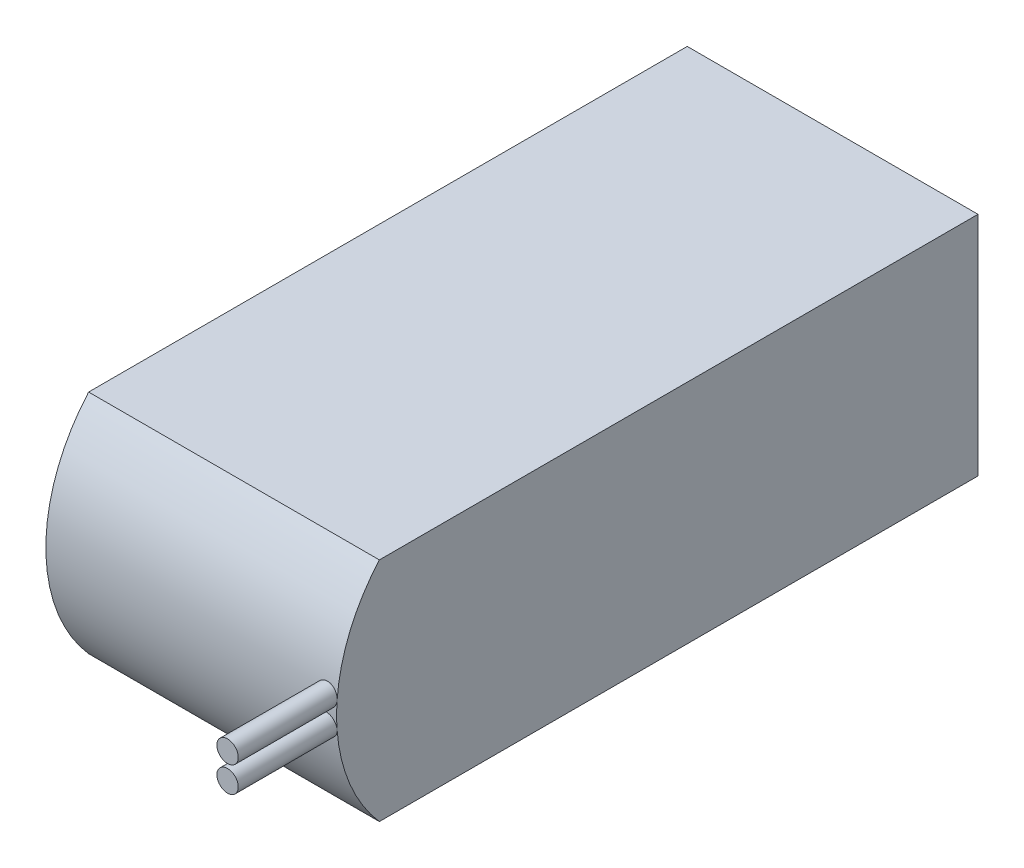
ISO-10303-21;
HEADER;
FILE_DESCRIPTION(('STEP AP214'),'2;1');
FILE_NAME('part.step','',(''),(''),'','','');
FILE_SCHEMA(('AUTOMOTIVE_DESIGN { 1 0 10303 214 1 1 1 1 }'));
ENDSEC;
DATA;
#1=APPLICATION_CONTEXT('core data for automotive mechanical design processes');
#2=APPLICATION_PROTOCOL_DEFINITION('international standard','automotive_design',2000,#1);
#3=PRODUCT_CONTEXT('',#1,'mechanical');
#4=PRODUCT('Part','Part','',(#3));
#5=PRODUCT_RELATED_PRODUCT_CATEGORY('part','',(#4));
#6=PRODUCT_DEFINITION_FORMATION('','',#4);
#7=PRODUCT_DEFINITION_CONTEXT('part definition',#1,'design');
#8=PRODUCT_DEFINITION('design','',#6,#7);
#9=PRODUCT_DEFINITION_SHAPE('','',#8);
#10=(LENGTH_UNIT() NAMED_UNIT(*) SI_UNIT(.MILLI.,.METRE.));
#11=(NAMED_UNIT(*) PLANE_ANGLE_UNIT() SI_UNIT($,.RADIAN.));
#12=(NAMED_UNIT(*) SI_UNIT($,.STERADIAN.) SOLID_ANGLE_UNIT());
#13=UNCERTAINTY_MEASURE_WITH_UNIT(LENGTH_MEASURE(1.E-05),#10,'distance_accuracy_value','');
#14=(GEOMETRIC_REPRESENTATION_CONTEXT(3) GLOBAL_UNCERTAINTY_ASSIGNED_CONTEXT((#13)) GLOBAL_UNIT_ASSIGNED_CONTEXT((#10,
#11,#12)) REPRESENTATION_CONTEXT('',''));
#15=CARTESIAN_POINT('',(0.,0.,0.));
#16=DIRECTION('',(0.,0.,1.));
#17=DIRECTION('',(1.,0.,0.));
#18=AXIS2_PLACEMENT_3D('',#15,#16,#17);
#19=CARTESIAN_POINT('',(0.,0.,140.));
#20=DIRECTION('',(1.,0.,0.));
#21=DIRECTION('',(0.,0.,-1.));
#22=AXIS2_PLACEMENT_3D('',#19,#20,#21);
#23=PLANE('',#22);
#24=DIRECTION('',(0.,-1.,0.));
#25=VECTOR('',#24,1.);
#26=CARTESIAN_POINT('',(0.,0.,0.));
#27=LINE('',#26,#25);
#28=CARTESIAN_POINT('',(0.,53.,0.));
#29=VERTEX_POINT('',#28);
#30=CARTESIAN_POINT('',(0.,0.,0.));
#31=VERTEX_POINT('',#30);
#32=EDGE_CURVE('E112',#29,#31,#27,.T.);
#33=ORIENTED_EDGE('',*,*,#32,.T.);
#34=DIRECTION('',(0.,0.,-1.));
#35=VECTOR('',#34,1.);
#36=CARTESIAN_POINT('',(0.,0.,140.));
#37=LINE('',#36,#35);
#38=CARTESIAN_POINT('',(0.,0.,140.));
#39=VERTEX_POINT('',#38);
#40=EDGE_CURVE('E138',#39,#31,#37,.T.);
#41=ORIENTED_EDGE('',*,*,#40,.F.);
#42=CARTESIAN_POINT('',(0.,26.5,109.8875));
#43=DIRECTION('',(1.,0.,0.));
#44=DIRECTION('',(0.,0.,-1.));
#45=AXIS2_PLACEMENT_3D('',#42,#43,#44);
#46=CIRCLE('',#45,40.1125);
#47=CARTESIAN_POINT('',(0.,53.,140.));
#48=VERTEX_POINT('',#47);
#49=EDGE_CURVE('E111',#48,#39,#46,.T.);
#50=ORIENTED_EDGE('',*,*,#49,.F.);
#51=DIRECTION('',(0.,0.,-1.));
#52=VECTOR('',#51,1.);
#53=CARTESIAN_POINT('',(0.,53.,140.));
#54=LINE('',#53,#52);
#55=EDGE_CURVE('E55',#48,#29,#54,.T.);
#56=ORIENTED_EDGE('',*,*,#55,.T.);
#57=EDGE_LOOP('',(#33,#41,#50,#56));
#58=FACE_BOUND('',#57,.T.);
#59=ADVANCED_FACE('F34',(#58),#23,.F.);
#60=CARTESIAN_POINT('',(0.,0.,140.));
#61=DIRECTION('',(0.,1.,0.));
#62=DIRECTION('',(0.,0.,1.));
#63=AXIS2_PLACEMENT_3D('',#60,#61,#62);
#64=PLANE('',#63);
#65=DIRECTION('',(1.,0.,0.));
#66=VECTOR('',#65,1.);
#67=CARTESIAN_POINT('',(0.,0.,0.));
#68=LINE('',#67,#66);
#69=CARTESIAN_POINT('',(68.,0.,0.));
#70=VERTEX_POINT('',#69);
#71=EDGE_CURVE('E115',#31,#70,#68,.T.);
#72=ORIENTED_EDGE('',*,*,#71,.T.);
#73=DIRECTION('',(0.,0.,-1.));
#74=VECTOR('',#73,1.);
#75=CARTESIAN_POINT('',(68.,0.,140.));
#76=LINE('',#75,#74);
#77=CARTESIAN_POINT('',(68.,0.,140.));
#78=VERTEX_POINT('',#77);
#79=EDGE_CURVE('E142',#78,#70,#76,.T.);
#80=ORIENTED_EDGE('',*,*,#79,.F.);
#81=DIRECTION('',(1.,0.,0.));
#82=VECTOR('',#81,1.);
#83=CARTESIAN_POINT('',(0.,0.,140.));
#84=LINE('',#83,#82);
#85=EDGE_CURVE('E83',#39,#78,#84,.T.);
#86=ORIENTED_EDGE('',*,*,#85,.F.);
#87=ORIENTED_EDGE('',*,*,#40,.T.);
#88=EDGE_LOOP('',(#72,#80,#86,#87));
#89=FACE_BOUND('',#88,.T.);
#90=ADVANCED_FACE('F132',(#89),#64,.F.);
#91=CARTESIAN_POINT('',(68.,0.,140.));
#92=DIRECTION('',(-1.,0.,0.));
#93=DIRECTION('',(0.,0.,1.));
#94=AXIS2_PLACEMENT_3D('',#91,#92,#93);
#95=PLANE('',#94);
#96=CARTESIAN_POINT('',(68.,26.5,109.8875));
#97=DIRECTION('',(1.,0.,0.));
#98=DIRECTION('',(0.,0.,-1.));
#99=AXIS2_PLACEMENT_3D('',#96,#97,#98);
#100=CIRCLE('',#99,40.1125);
#101=CARTESIAN_POINT('',(68.,29.5,149.887658202812));
#102=VERTEX_POINT('',#101);
#103=CARTESIAN_POINT('',(68.,23.5,149.887658202812));
#104=VERTEX_POINT('',#103);
#105=EDGE_CURVE('E93',#102,#104,#100,.T.);
#106=ORIENTED_EDGE('',*,*,#105,.T.);
#107=EDGE_CURVE('E96',#104,#78,#100,.T.);
#108=ORIENTED_EDGE('',*,*,#107,.T.);
#109=ORIENTED_EDGE('',*,*,#79,.T.);
#110=DIRECTION('',(0.,1.,0.));
#111=VECTOR('',#110,1.);
#112=CARTESIAN_POINT('',(68.,0.,0.));
#113=LINE('',#112,#111);
#114=CARTESIAN_POINT('',(68.,53.,0.));
#115=VERTEX_POINT('',#114);
#116=EDGE_CURVE('E74',#70,#115,#113,.T.);
#117=ORIENTED_EDGE('',*,*,#116,.T.);
#118=DIRECTION('',(0.,0.,-1.));
#119=VECTOR('',#118,1.);
#120=CARTESIAN_POINT('',(68.,53.,140.));
#121=LINE('',#120,#119);
#122=CARTESIAN_POINT('',(68.,53.,140.));
#123=VERTEX_POINT('',#122);
#124=EDGE_CURVE('E145',#123,#115,#121,.T.);
#125=ORIENTED_EDGE('',*,*,#124,.F.);
#126=EDGE_CURVE('E98',#123,#102,#100,.T.);
#127=ORIENTED_EDGE('',*,*,#126,.T.);
#128=EDGE_LOOP('',(#106,#108,#109,#117,#125,#127));
#129=FACE_BOUND('',#128,.T.);
#130=ADVANCED_FACE('F95',(#129),#95,.F.);
#131=CARTESIAN_POINT('',(0.,53.,140.));
#132=DIRECTION('',(0.,-1.,0.));
#133=DIRECTION('',(0.,0.,-1.));
#134=AXIS2_PLACEMENT_3D('',#131,#132,#133);
#135=PLANE('',#134);
#136=DIRECTION('',(-1.,0.,0.));
#137=VECTOR('',#136,1.);
#138=CARTESIAN_POINT('',(0.,53.,0.));
#139=LINE('',#138,#137);
#140=EDGE_CURVE('E77',#115,#29,#139,.T.);
#141=ORIENTED_EDGE('',*,*,#140,.T.);
#142=ORIENTED_EDGE('',*,*,#55,.F.);
#143=DIRECTION('',(-1.,0.,0.));
#144=VECTOR('',#143,1.);
#145=CARTESIAN_POINT('',(0.,53.,140.));
#146=LINE('',#145,#144);
#147=EDGE_CURVE('E248',#123,#48,#146,.T.);
#148=ORIENTED_EDGE('',*,*,#147,.F.);
#149=ORIENTED_EDGE('',*,*,#124,.T.);
#150=EDGE_LOOP('',(#141,#142,#148,#149));
#151=FACE_BOUND('',#150,.T.);
#152=ADVANCED_FACE('F206',(#151),#135,.F.);
#153=CARTESIAN_POINT('',(0.,0.,0.));
#154=DIRECTION('',(0.,0.,-1.));
#155=DIRECTION('',(-1.,0.,0.));
#156=AXIS2_PLACEMENT_3D('',#153,#154,#155);
#157=PLANE('',#156);
#158=ORIENTED_EDGE('',*,*,#140,.F.);
#159=ORIENTED_EDGE('',*,*,#116,.F.);
#160=ORIENTED_EDGE('',*,*,#71,.F.);
#161=ORIENTED_EDGE('',*,*,#32,.F.);
#162=EDGE_LOOP('',(#158,#159,#160,#161));
#163=FACE_BOUND('',#162,.T.);
#164=ADVANCED_FACE('F140',(#163),#157,.T.);
#165=CARTESIAN_POINT('',(0.,26.5,109.8875));
#166=DIRECTION('',(1.,0.,0.));
#167=DIRECTION('',(0.,0.,-1.));
#168=AXIS2_PLACEMENT_3D('',#165,#166,#167);
#169=CYLINDRICAL_SURFACE('',#168,40.1125);
#170=ORIENTED_EDGE('',*,*,#107,.F.);
#171=CARTESIAN_POINT('',(63.,23.5,149.887658202812));
#172=CARTESIAN_POINT('',(63.0000062251369,23.3590160846374,149.877083380765));
#173=CARTESIAN_POINT('',(63.0119657313128,23.2179875037208,149.865749733109));
#174=CARTESIAN_POINT('',(63.0594538956752,22.9399343580414,149.841950658494));
#175=CARTESIAN_POINT('',(63.0950112852451,22.8029148871281,149.829483867877));
#176=CARTESIAN_POINT('',(63.1886439835675,22.5369368080331,149.803970618494));
#177=CARTESIAN_POINT('',(63.2467057736336,22.407973414364,149.790924511888));
#178=CARTESIAN_POINT('',(63.3836902509248,22.1616848201086,149.764900018234));
#179=CARTESIAN_POINT('',(63.4626079685317,22.0443568561417,149.751921615803));
#180=CARTESIAN_POINT('',(63.6392702215313,21.8244059423644,149.726724049149));
#181=CARTESIAN_POINT('',(63.7370479685695,21.7218094984128,149.714506275319));
#182=CARTESIAN_POINT('',(63.9486163429538,21.5345052925898,149.691588301941));
#183=CARTESIAN_POINT('',(64.062407340832,21.4497979447695,149.68088813752));
#184=CARTESIAN_POINT('',(64.3023592725654,21.3010203379496,149.661723986009));
#185=CARTESIAN_POINT('',(64.4284736423816,21.2368760371035,149.653251996135));
#186=CARTESIAN_POINT('',(64.6898382434072,21.1307110019086,149.639056935016));
#187=CARTESIAN_POINT('',(64.8250879793734,21.0886890693545,149.633333714892));
#188=CARTESIAN_POINT('',(65.0996946556097,21.0282884090456,149.62506358104));
#189=CARTESIAN_POINT('',(65.2390087636072,21.009718418488,149.622490977681));
#190=CARTESIAN_POINT('',(65.5187992676072,20.9961507211528,149.620614018385));
#191=CARTESIAN_POINT('',(65.6592756163372,21.0011520603088,149.621309530168));
#192=CARTESIAN_POINT('',(65.9366006040314,21.0344817071428,149.625907616517));
#193=CARTESIAN_POINT('',(66.0734647888306,21.0626833208659,149.629792772579));
#194=CARTESIAN_POINT('',(66.3404921154475,21.1414094789408,149.640483896887));
#195=CARTESIAN_POINT('',(66.4706551780551,21.1919342870949,149.647289899651));
#196=CARTESIAN_POINT('',(66.7209938927367,21.3139946746523,149.663394531733));
#197=CARTESIAN_POINT('',(66.8411414202133,21.3855870214899,149.672699889686));
#198=CARTESIAN_POINT('',(67.0677451514839,21.5476724024217,149.693200087565));
#199=CARTESIAN_POINT('',(67.1742007387965,21.638166287079,149.704395012515));
#200=CARTESIAN_POINT('',(67.3713192834062,21.8363140300814,149.728091139386));
#201=CARTESIAN_POINT('',(67.4618470906088,21.9441011665883,149.740602203396));
#202=CARTESIAN_POINT('',(67.6235511684802,22.1732748439264,149.766133109889));
#203=CARTESIAN_POINT('',(67.694726719465,22.2946618902827,149.779152971274));
#204=CARTESIAN_POINT('',(67.8161125277773,22.5484120649026,149.805089493705));
#205=CARTESIAN_POINT('',(67.8661956819709,22.680836133455,149.818005081668));
#206=CARTESIAN_POINT('',(67.9433453910227,22.9523007910332,149.843038464303));
#207=CARTESIAN_POINT('',(67.9704119447934,23.0913413803716,149.855156258938));
#208=CARTESIAN_POINT('',(68.0007089553383,23.3720423688582,149.878103308156));
#209=CARTESIAN_POINT('',(68.0039496435683,23.5137016172822,149.888933113871));
#210=CARTESIAN_POINT('',(67.9864713516889,23.7956497851176,149.908983250997));
#211=CARTESIAN_POINT('',(67.9657529349624,23.9359387366724,149.918203620246));
#212=CARTESIAN_POINT('',(67.9010364915985,24.2105171227853,149.934844148895));
#213=CARTESIAN_POINT('',(67.8571381074244,24.3448295889022,149.942271816859));
#214=CARTESIAN_POINT('',(67.7473355462116,24.6042272017047,149.955387176205));
#215=CARTESIAN_POINT('',(67.6814317727475,24.7293125175632,149.961074899495));
#216=CARTESIAN_POINT('',(67.5297299052815,24.96626117465,149.970842405106));
#217=CARTESIAN_POINT('',(67.4439977341828,25.0781665141451,149.974927397233));
#218=CARTESIAN_POINT('',(67.2549481905257,25.2860271553818,149.981760973631));
#219=CARTESIAN_POINT('',(67.1516308784441,25.3819825119747,149.984509562498));
#220=CARTESIAN_POINT('',(66.9304158962345,25.5551468593164,149.98896417449));
#221=CARTESIAN_POINT('',(66.812527570317,25.6323677710461,149.990670861644));
#222=CARTESIAN_POINT('',(66.5654627957647,25.7659457487956,149.993338765967));
#223=CARTESIAN_POINT('',(66.43628633339,25.8223027894192,149.994299982229));
#224=CARTESIAN_POINT('',(66.1702399002796,25.9125756108917,149.995724123942));
#225=CARTESIAN_POINT('',(66.033366012277,25.9464798511748,149.99618679322));
#226=CARTESIAN_POINT('',(65.7558686523979,25.9908381094265,149.996774611401));
#227=CARTESIAN_POINT('',(65.6152451669584,26.0012920425591,149.996899759081));
#228=CARTESIAN_POINT('',(65.3341951212174,25.9984523226403,149.996864340503));
#229=CARTESIAN_POINT('',(65.1937686340614,25.9851514254541,149.996703687089));
#230=CARTESIAN_POINT('',(64.9171414923601,25.9351655558693,149.996030696304));
#231=CARTESIAN_POINT('',(64.7809408503789,25.898480513953,149.995518357889));
#232=CARTESIAN_POINT('',(64.516629936732,25.8027677006292,149.993968293832));
#233=CARTESIAN_POINT('',(64.3885198432822,25.743739437253,149.992930556622));
#234=CARTESIAN_POINT('',(64.1440373882278,25.6050220168044,149.990074257733));
#235=CARTESIAN_POINT('',(64.0276645572122,25.5253336864501,149.988255727296));
#236=CARTESIAN_POINT('',(63.8100022734061,25.3476043363302,149.983541168618));
#237=CARTESIAN_POINT('',(63.7087067185069,25.2495707777459,149.980645577956));
#238=CARTESIAN_POINT('',(63.5239947628429,25.0378996587587,149.973483928149));
#239=CARTESIAN_POINT('',(63.440582539192,24.9242584629363,149.969217549401));
#240=CARTESIAN_POINT('',(63.2940335151667,24.6846684803154,149.959080876335));
#241=CARTESIAN_POINT('',(63.2308954249535,24.5587204771405,149.953210684097));
#242=CARTESIAN_POINT('',(63.1267090634828,24.2982027816678,149.939736994829));
#243=CARTESIAN_POINT('',(63.0856350777872,24.1636433311878,149.93213553028));
#244=CARTESIAN_POINT('',(63.0374668307519,23.9402118251502,149.918334398189));
#245=CARTESIAN_POINT('',(63.0234309089276,23.8527426451284,149.91264776014));
#246=CARTESIAN_POINT('',(63.0046955498164,23.6768548338686,149.900626342057));
#247=CARTESIAN_POINT('',(62.9999960951044,23.5884362044029,149.894291563232));
#248=CARTESIAN_POINT('',(63.,23.5,149.887658202812));
#249=B_SPLINE_CURVE_WITH_KNOTS('',3,(#171,#172,#173,#174,#175,#176,#177,#178,#179,#180,#181,
#182,#183,#184,#185,#186,#187,#188,#189,#190,#191,#192,#193,#194,#195,#196,#197,#198,#199,#200,
#201,#202,#203,#204,#205,#206,#207,#208,#209,#210,#211,#212,#213,#214,#215,#216,#217,#218,#219,
#220,#221,#222,#223,#224,#225,#226,#227,#228,#229,#230,#231,#232,#233,#234,#235,#236,#237,#238,
#239,#240,#241,#242,#243,#244,#245,#246,#247,#248),.UNSPECIFIED.,.T.,.F.,(4,2,2,2,2,2,2,2,2,2,2,
2,2,2,2,2,2,2,2,2,2,2,2,2,2,2,2,2,2,2,2,2,2,2,2,2,2,2,4),(0.,0.423815049520662,0.84814706011062,
1.27222456301298,1.69620110631981,2.1209311837584,2.54567109068578,2.96886398579513,
3.39203395731316,3.81172998835493,4.23140903204423,4.64881135357193,5.06621860784606,
5.48476104759511,5.90332232567883,6.32527980945991,6.7472529831186,7.17173379876135,
7.59621463446046,8.02051317622879,8.44480174109375,8.86728111219375,9.28975273553027,
9.71083947265622,10.1319247616542,10.5527414014575,10.9735585534894,11.3945918347551,
11.8156266391849,12.2367898618613,12.6579543366017,13.0791280853797,13.5002849833789,
13.9212709636223,14.3423551691462,14.7634125800147,15.1839782022743,15.4498288434905,
15.7156789885374),.UNSPECIFIED.);
#250=EDGE_CURVE('E11',#104,#104,#249,.T.);
#251=ORIENTED_EDGE('',*,*,#250,.F.);
#252=ORIENTED_EDGE('',*,*,#105,.F.);
#253=CARTESIAN_POINT('',(68.,29.5,149.887658202812));
#254=CARTESIAN_POINT('',(67.9999937748631,29.6409839153626,149.877083380765));
#255=CARTESIAN_POINT('',(67.9880342686872,29.7820124962792,149.865749733109));
#256=CARTESIAN_POINT('',(67.9405461043248,30.0600656419586,149.841950658494));
#257=CARTESIAN_POINT('',(67.9049887147549,30.1970851128719,149.829483867877));
#258=CARTESIAN_POINT('',(67.8113560164326,30.4630631919669,149.803970618494));
#259=CARTESIAN_POINT('',(67.7532942263664,30.592026585636,149.790924511888));
#260=CARTESIAN_POINT('',(67.6163097490752,30.8383151798914,149.764900018234));
#261=CARTESIAN_POINT('',(67.5373920314683,30.9556431438583,149.751921615803));
#262=CARTESIAN_POINT('',(67.3607297784687,31.1755940576356,149.726724049149));
#263=CARTESIAN_POINT('',(67.2629520314305,31.2781905015872,149.714506275319));
#264=CARTESIAN_POINT('',(67.0513836570463,31.4654947074101,149.691588301941));
#265=CARTESIAN_POINT('',(66.937592659168,31.5502020552305,149.68088813752));
#266=CARTESIAN_POINT('',(66.6976407274347,31.6989796620504,149.661723986009));
#267=CARTESIAN_POINT('',(66.5715263576184,31.7631239628965,149.653251996135));
#268=CARTESIAN_POINT('',(66.3101617565928,31.8692889980914,149.639056935016));
#269=CARTESIAN_POINT('',(66.1749120206266,31.9113109306455,149.633333714892));
#270=CARTESIAN_POINT('',(65.9003053443903,31.9717115909544,149.62506358104));
#271=CARTESIAN_POINT('',(65.7609912363927,31.990281581512,149.622490977681));
#272=CARTESIAN_POINT('',(65.4812007323928,32.0038492788472,149.620614018385));
#273=CARTESIAN_POINT('',(65.3407243836628,31.9988479396912,149.621309530168));
#274=CARTESIAN_POINT('',(65.0633993959686,31.9655182928572,149.625907616517));
#275=CARTESIAN_POINT('',(64.9265352111694,31.9373166791341,149.629792772579));
#276=CARTESIAN_POINT('',(64.6595078845525,31.8585905210592,149.640483896887));
#277=CARTESIAN_POINT('',(64.5293448219449,31.8080657129051,149.647289899651));
#278=CARTESIAN_POINT('',(64.2790061072633,31.6860053253477,149.663394531733));
#279=CARTESIAN_POINT('',(64.1588585797867,31.6144129785101,149.672699889686));
#280=CARTESIAN_POINT('',(63.9322548485161,31.4523275975783,149.693200087565));
#281=CARTESIAN_POINT('',(63.8257992612035,31.361833712921,149.704395012515));
#282=CARTESIAN_POINT('',(63.6286807165938,31.1636859699186,149.728091139386));
#283=CARTESIAN_POINT('',(63.5381529093912,31.0558988334117,149.740602203396));
#284=CARTESIAN_POINT('',(63.3764488315198,30.8267251560736,149.766133109889));
#285=CARTESIAN_POINT('',(63.305273280535,30.7053381097173,149.779152971274));
#286=CARTESIAN_POINT('',(63.1838874722227,30.4515879350974,149.805089493705));
#287=CARTESIAN_POINT('',(63.1338043180291,30.319163866545,149.818005081668));
#288=CARTESIAN_POINT('',(63.0566546089773,30.0476992089668,149.843038464303));
#289=CARTESIAN_POINT('',(63.0295880552066,29.9086586196284,149.855156258938));
#290=CARTESIAN_POINT('',(62.9992910446617,29.6279576311418,149.878103308156));
#291=CARTESIAN_POINT('',(62.9960503564317,29.4862983827178,149.888933113871));
#292=CARTESIAN_POINT('',(63.0135286483111,29.2043502148824,149.908983250997));
#293=CARTESIAN_POINT('',(63.0342470650376,29.0640612633276,149.918203620246));
#294=CARTESIAN_POINT('',(63.0989635084015,28.7894828772147,149.934844148895));
#295=CARTESIAN_POINT('',(63.1428618925756,28.6551704110978,149.942271816859));
#296=CARTESIAN_POINT('',(63.2526644537884,28.3957727982952,149.955387176205));
#297=CARTESIAN_POINT('',(63.3185682272525,28.2706874824368,149.961074899495));
#298=CARTESIAN_POINT('',(63.4702700947186,28.03373882535,149.970842405106));
#299=CARTESIAN_POINT('',(63.5560022658172,27.9218334858549,149.974927397233));
#300=CARTESIAN_POINT('',(63.7450518094743,27.7139728446182,149.981760973631));
#301=CARTESIAN_POINT('',(63.8483691215559,27.6180174880253,149.984509562498));
#302=CARTESIAN_POINT('',(64.0695841037655,27.4448531406836,149.98896417449));
#303=CARTESIAN_POINT('',(64.187472429683,27.3676322289539,149.990670861644));
#304=CARTESIAN_POINT('',(64.4345372042353,27.2340542512044,149.993338765967));
#305=CARTESIAN_POINT('',(64.5637136666101,27.1776972105808,149.994299982229));
#306=CARTESIAN_POINT('',(64.8297600997204,27.0874243891082,149.995724123942));
#307=CARTESIAN_POINT('',(64.966633987723,27.0535201488252,149.99618679322));
#308=CARTESIAN_POINT('',(65.2441313476021,27.0091618905735,149.996774611401));
#309=CARTESIAN_POINT('',(65.3847548330416,26.9987079574409,149.996899759081));
#310=CARTESIAN_POINT('',(65.6658048787826,27.0015476773597,149.996864340503));
#311=CARTESIAN_POINT('',(65.8062313659386,27.0148485745459,149.996703687089));
#312=CARTESIAN_POINT('',(66.0828585076399,27.0648344441307,149.996030696304));
#313=CARTESIAN_POINT('',(66.2190591496211,27.101519486047,149.995518357889));
#314=CARTESIAN_POINT('',(66.483370063268,27.1972322993708,149.993968293832));
#315=CARTESIAN_POINT('',(66.6114801567178,27.256260562747,149.992930556622));
#316=CARTESIAN_POINT('',(66.8559626117722,27.3949779831956,149.990074257733));
#317=CARTESIAN_POINT('',(66.9723354427878,27.4746663135499,149.988255727296));
#318=CARTESIAN_POINT('',(67.189997726594,27.6523956636698,149.983541168618));
#319=CARTESIAN_POINT('',(67.2912932814931,27.7504292222541,149.980645577956));
#320=CARTESIAN_POINT('',(67.4760052371572,27.9621003412413,149.973483928149));
#321=CARTESIAN_POINT('',(67.559417460808,28.0757415370637,149.969217549401));
#322=CARTESIAN_POINT('',(67.7059664848333,28.3153315196846,149.959080876335));
#323=CARTESIAN_POINT('',(67.7691045750465,28.4412795228595,149.953210684097));
#324=CARTESIAN_POINT('',(67.8732909365172,28.7017972183322,149.939736994829));
#325=CARTESIAN_POINT('',(67.9143649222128,28.8363566688122,149.93213553028));
#326=CARTESIAN_POINT('',(67.9625331692481,29.0597881748498,149.918334398189));
#327=CARTESIAN_POINT('',(67.9765690910724,29.1472573548716,149.91264776014));
#328=CARTESIAN_POINT('',(67.9953044501836,29.3231451661314,149.900626342057));
#329=CARTESIAN_POINT('',(68.0000039048956,29.4115637955971,149.894291563232));
#330=CARTESIAN_POINT('',(68.,29.5,149.887658202812));
#331=B_SPLINE_CURVE_WITH_KNOTS('',3,(#253,#254,#255,#256,#257,#258,#259,#260,#261,#262,#263,
#264,#265,#266,#267,#268,#269,#270,#271,#272,#273,#274,#275,#276,#277,#278,#279,#280,#281,#282,
#283,#284,#285,#286,#287,#288,#289,#290,#291,#292,#293,#294,#295,#296,#297,#298,#299,#300,#301,
#302,#303,#304,#305,#306,#307,#308,#309,#310,#311,#312,#313,#314,#315,#316,#317,#318,#319,#320,
#321,#322,#323,#324,#325,#326,#327,#328,#329,#330),.UNSPECIFIED.,.T.,.F.,(4,2,2,2,2,2,2,2,2,2,2,
2,2,2,2,2,2,2,2,2,2,2,2,2,2,2,2,2,2,2,2,2,2,2,2,2,2,2,4),(0.,0.423815049520662,0.84814706011062,
1.27222456301298,1.69620110631981,2.12093118375838,2.54567109068577,2.96886398579515,
3.39203395731318,3.81172998835495,4.23140903204423,4.64881135357195,5.06621860784607,
5.48476104759511,5.90332232567883,6.32527980945991,6.7472529831186,7.17173379876135,
7.59621463446046,8.02051317622879,8.44480174109375,8.86728111219376,9.28975273553027,
9.71083947265622,10.1319247616542,10.5527414014575,10.9735585534894,11.3945918347551,
11.8156266391849,12.2367898618613,12.6579543366017,13.0791280853797,13.5002849833789,
13.9212709636223,14.3423551691462,14.7634125800147,15.1839782022743,15.4498288434905,
15.7156789885374),.UNSPECIFIED.);
#332=EDGE_CURVE('E47',#102,#102,#331,.T.);
#333=ORIENTED_EDGE('',*,*,#332,.F.);
#334=ORIENTED_EDGE('',*,*,#126,.F.);
#335=ORIENTED_EDGE('',*,*,#147,.T.);
#336=ORIENTED_EDGE('',*,*,#49,.T.);
#337=ORIENTED_EDGE('',*,*,#85,.T.);
#338=EDGE_LOOP('',(#170,#251,#252,#333,#334,#335,#336,#337));
#339=FACE_BOUND('',#338,.T.);
#340=ADVANCED_FACE('F103',(#339),#169,.T.);
#341=CARTESIAN_POINT('',(65.5,29.5,173.));
#342=DIRECTION('',(0.,0.,-1.));
#343=DIRECTION('',(-1.,0.,0.));
#344=AXIS2_PLACEMENT_3D('',#341,#342,#343);
#345=CYLINDRICAL_SURFACE('',#344,2.5);
#346=ORIENTED_EDGE('',*,*,#332,.T.);
#347=EDGE_LOOP('',(#346));
#348=FACE_BOUND('',#347,.T.);
#349=CARTESIAN_POINT('',(65.5,29.5,173.));
#350=DIRECTION('',(0.,0.,-1.));
#351=DIRECTION('',(-1.,0.,0.));
#352=AXIS2_PLACEMENT_3D('',#349,#350,#351);
#353=CIRCLE('',#352,2.5);
#354=CARTESIAN_POINT('',(63.,29.5,173.));
#355=VERTEX_POINT('',#354);
#356=EDGE_CURVE('E105',#355,#355,#353,.T.);
#357=ORIENTED_EDGE('',*,*,#356,.T.);
#358=EDGE_LOOP('',(#357));
#359=FACE_BOUND('',#358,.T.);
#360=ADVANCED_FACE('F154',(#348,#359),#345,.T.);
#361=CARTESIAN_POINT('',(65.5,29.5,173.));
#362=DIRECTION('',(0.,0.,-1.));
#363=DIRECTION('',(-1.,0.,0.));
#364=AXIS2_PLACEMENT_3D('',#361,#362,#363);
#365=PLANE('',#364);
#366=ORIENTED_EDGE('',*,*,#356,.F.);
#367=EDGE_LOOP('',(#366));
#368=FACE_BOUND('',#367,.T.);
#369=ADVANCED_FACE('F129',(#368),#365,.F.);
#370=CARTESIAN_POINT('',(65.5,23.5,173.));
#371=DIRECTION('',(0.,0.,-1.));
#372=DIRECTION('',(-1.,0.,0.));
#373=AXIS2_PLACEMENT_3D('',#370,#371,#372);
#374=CYLINDRICAL_SURFACE('',#373,2.5);
#375=ORIENTED_EDGE('',*,*,#250,.T.);
#376=EDGE_LOOP('',(#375));
#377=FACE_BOUND('',#376,.T.);
#378=CARTESIAN_POINT('',(65.5,23.5,173.));
#379=DIRECTION('',(0.,0.,-1.));
#380=DIRECTION('',(-1.,0.,0.));
#381=AXIS2_PLACEMENT_3D('',#378,#379,#380);
#382=CIRCLE('',#381,2.5);
#383=CARTESIAN_POINT('',(63.,23.5,173.));
#384=VERTEX_POINT('',#383);
#385=EDGE_CURVE('E107',#384,#384,#382,.T.);
#386=ORIENTED_EDGE('',*,*,#385,.T.);
#387=EDGE_LOOP('',(#386));
#388=FACE_BOUND('',#387,.T.);
#389=ADVANCED_FACE('F121',(#377,#388),#374,.T.);
#390=CARTESIAN_POINT('',(65.5,23.5,173.));
#391=DIRECTION('',(0.,0.,-1.));
#392=DIRECTION('',(-1.,0.,0.));
#393=AXIS2_PLACEMENT_3D('',#390,#391,#392);
#394=PLANE('',#393);
#395=ORIENTED_EDGE('',*,*,#385,.F.);
#396=EDGE_LOOP('',(#395));
#397=FACE_BOUND('',#396,.T.);
#398=ADVANCED_FACE('F123',(#397),#394,.F.);
#399=CLOSED_SHELL('',(#59,#90,#130,#152,#164,#340,#360,#369,#389,#398));
#400=MANIFOLD_SOLID_BREP('B2',#399);
#401=ADVANCED_BREP_SHAPE_REPRESENTATION('',(#18,#400),#14);
#402=SHAPE_DEFINITION_REPRESENTATION(#9,#401);
ENDSEC;
END-ISO-10303-21;
